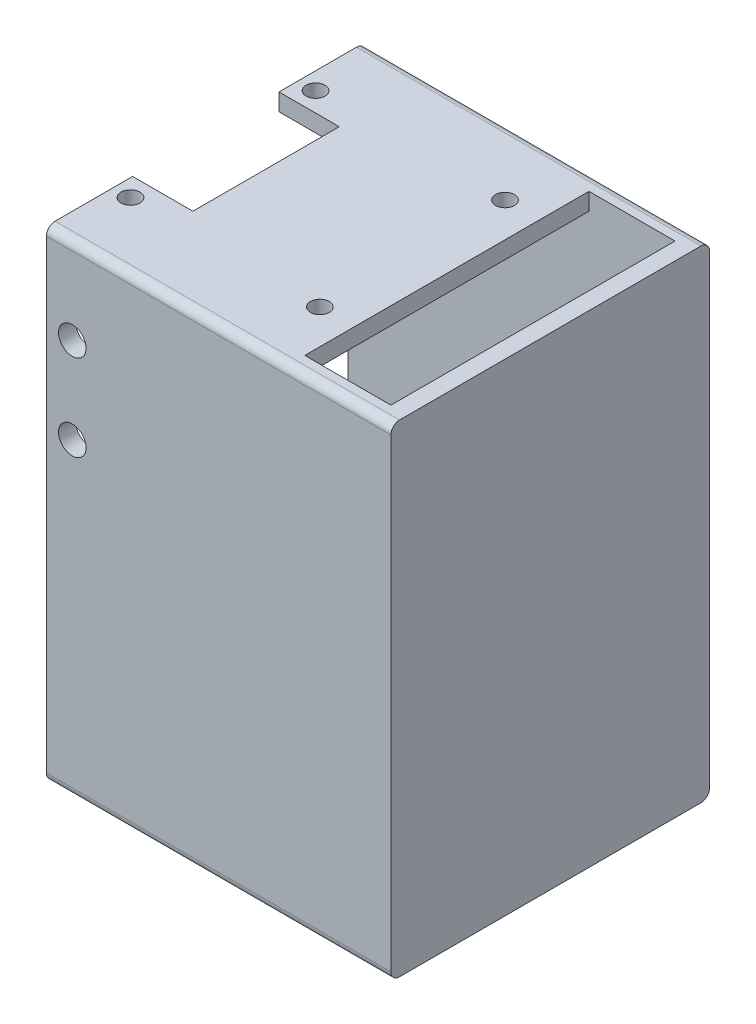
ISO-10303-21;
HEADER;
FILE_DESCRIPTION(('STEP AP214'),'2;1');
FILE_NAME('part.step','',(''),(''),'','','');
FILE_SCHEMA(('AUTOMOTIVE_DESIGN { 1 0 10303 214 1 1 1 1 }'));
ENDSEC;
DATA;
#1=APPLICATION_CONTEXT('core data for automotive mechanical design processes');
#2=APPLICATION_PROTOCOL_DEFINITION('international standard','automotive_design',2000,#1);
#3=PRODUCT_CONTEXT('',#1,'mechanical');
#4=PRODUCT('Part','Part','',(#3));
#5=PRODUCT_RELATED_PRODUCT_CATEGORY('part','',(#4));
#6=PRODUCT_DEFINITION_FORMATION('','',#4);
#7=PRODUCT_DEFINITION_CONTEXT('part definition',#1,'design');
#8=PRODUCT_DEFINITION('design','',#6,#7);
#9=PRODUCT_DEFINITION_SHAPE('','',#8);
#10=(LENGTH_UNIT() NAMED_UNIT(*) SI_UNIT(.MILLI.,.METRE.));
#11=(NAMED_UNIT(*) PLANE_ANGLE_UNIT() SI_UNIT($,.RADIAN.));
#12=(NAMED_UNIT(*) SI_UNIT($,.STERADIAN.) SOLID_ANGLE_UNIT());
#13=UNCERTAINTY_MEASURE_WITH_UNIT(LENGTH_MEASURE(1.E-05),#10,'distance_accuracy_value','');
#14=(GEOMETRIC_REPRESENTATION_CONTEXT(3) GLOBAL_UNCERTAINTY_ASSIGNED_CONTEXT((#13)) GLOBAL_UNIT_ASSIGNED_CONTEXT((#10,
#11,#12)) REPRESENTATION_CONTEXT('',''));
#15=CARTESIAN_POINT('',(0.,0.,0.));
#16=DIRECTION('',(0.,0.,1.));
#17=DIRECTION('',(1.,0.,0.));
#18=AXIS2_PLACEMENT_3D('',#15,#16,#17);
#19=CARTESIAN_POINT('',(20.,51.,18.5));
#20=DIRECTION('',(-1.,0.,0.));
#21=DIRECTION('',(0.,0.,1.));
#22=AXIS2_PLACEMENT_3D('',#19,#20,#21);
#23=PLANE('',#22);
#24=DIRECTION('',(0.,0.,-1.));
#25=VECTOR('',#24,1.);
#26=CARTESIAN_POINT('',(20.,51.,18.5));
#27=LINE('',#26,#25);
#28=CARTESIAN_POINT('',(20.,51.,17.5));
#29=VERTEX_POINT('',#28);
#30=CARTESIAN_POINT('',(20.,51.,-17.5));
#31=VERTEX_POINT('',#30);
#32=EDGE_CURVE('E206',#29,#31,#27,.T.);
#33=ORIENTED_EDGE('',*,*,#32,.F.);
#34=CARTESIAN_POINT('',(20.,50.,17.5));
#35=DIRECTION('',(-1.,0.,0.));
#36=DIRECTION('',(0.,0.,1.));
#37=AXIS2_PLACEMENT_3D('',#34,#35,#36);
#38=CIRCLE('',#37,1.);
#39=CARTESIAN_POINT('',(20.,50.,18.5));
#40=VERTEX_POINT('',#39);
#41=EDGE_CURVE('E250',#29,#40,#38,.F.);
#42=ORIENTED_EDGE('',*,*,#41,.T.);
#43=DIRECTION('',(0.,-1.,0.));
#44=VECTOR('',#43,1.);
#45=CARTESIAN_POINT('',(20.,51.,18.5));
#46=LINE('',#45,#44);
#47=CARTESIAN_POINT('',(20.,-4.,18.5));
#48=VERTEX_POINT('',#47);
#49=EDGE_CURVE('E218',#40,#48,#46,.T.);
#50=ORIENTED_EDGE('',*,*,#49,.T.);
#51=CARTESIAN_POINT('',(20.,-4.,17.5));
#52=DIRECTION('',(-1.,0.,0.));
#53=DIRECTION('',(0.,0.,1.));
#54=AXIS2_PLACEMENT_3D('',#51,#52,#53);
#55=CIRCLE('',#54,1.);
#56=CARTESIAN_POINT('',(20.,-5.,17.5));
#57=VERTEX_POINT('',#56);
#58=EDGE_CURVE('E244',#48,#57,#55,.F.);
#59=ORIENTED_EDGE('',*,*,#58,.T.);
#60=DIRECTION('',(0.,0.,-1.));
#61=VECTOR('',#60,1.);
#62=CARTESIAN_POINT('',(20.,-5.,-18.5));
#63=LINE('',#62,#61);
#64=CARTESIAN_POINT('',(20.,-5.,-17.5));
#65=VERTEX_POINT('',#64);
#66=EDGE_CURVE('E272',#57,#65,#63,.T.);
#67=ORIENTED_EDGE('',*,*,#66,.T.);
#68=CARTESIAN_POINT('',(20.,-4.,-17.5));
#69=DIRECTION('',(-1.,0.,0.));
#70=DIRECTION('',(0.,0.,1.));
#71=AXIS2_PLACEMENT_3D('',#68,#69,#70);
#72=CIRCLE('',#71,1.);
#73=CARTESIAN_POINT('',(20.,-4.,-18.5));
#74=VERTEX_POINT('',#73);
#75=EDGE_CURVE('E246',#65,#74,#72,.F.);
#76=ORIENTED_EDGE('',*,*,#75,.T.);
#77=DIRECTION('',(0.,-1.,0.));
#78=VECTOR('',#77,1.);
#79=CARTESIAN_POINT('',(20.,51.,-18.5));
#80=LINE('',#79,#78);
#81=CARTESIAN_POINT('',(20.,50.,-18.5));
#82=VERTEX_POINT('',#81);
#83=EDGE_CURVE('E226',#82,#74,#80,.T.);
#84=ORIENTED_EDGE('',*,*,#83,.F.);
#85=CARTESIAN_POINT('',(20.,50.,-17.5));
#86=DIRECTION('',(-1.,0.,0.));
#87=DIRECTION('',(0.,0.,1.));
#88=AXIS2_PLACEMENT_3D('',#85,#86,#87);
#89=CIRCLE('',#88,1.);
#90=EDGE_CURVE('E248',#82,#31,#89,.F.);
#91=ORIENTED_EDGE('',*,*,#90,.T.);
#92=EDGE_LOOP('',(#33,#42,#50,#59,#67,#76,#84,#91));
#93=FACE_BOUND('',#92,.T.);
#94=ADVANCED_FACE('F39',(#93),#23,.F.);
#95=CARTESIAN_POINT('',(-20.,51.,-18.5));
#96=DIRECTION('',(0.,0.,1.));
#97=DIRECTION('',(1.,0.,0.));
#98=AXIS2_PLACEMENT_3D('',#95,#96,#97);
#99=PLANE('',#98);
#100=CARTESIAN_POINT('',(-17.,41.,-18.5));
#101=DIRECTION('',(0.,0.,-1.));
#102=DIRECTION('',(-1.,0.,0.));
#103=AXIS2_PLACEMENT_3D('',#100,#101,#102);
#104=CIRCLE('',#103,1.6);
#105=CARTESIAN_POINT('',(-18.6,41.,-18.5));
#106=VERTEX_POINT('',#105);
#107=EDGE_CURVE('E502',#106,#106,#104,.T.);
#108=ORIENTED_EDGE('',*,*,#107,.F.);
#109=EDGE_LOOP('',(#108));
#110=FACE_BOUND('',#109,.T.);
#111=CARTESIAN_POINT('',(-17.,31.,-18.5));
#112=DIRECTION('',(0.,0.,-1.));
#113=DIRECTION('',(-1.,0.,0.));
#114=AXIS2_PLACEMENT_3D('',#111,#112,#113);
#115=CIRCLE('',#114,1.6);
#116=CARTESIAN_POINT('',(-18.6,31.,-18.5));
#117=VERTEX_POINT('',#116);
#118=EDGE_CURVE('E499',#117,#117,#115,.T.);
#119=ORIENTED_EDGE('',*,*,#118,.F.);
#120=EDGE_LOOP('',(#119));
#121=FACE_BOUND('',#120,.T.);
#122=DIRECTION('',(0.,-1.,0.));
#123=VECTOR('',#122,1.);
#124=CARTESIAN_POINT('',(-20.,51.,-18.5));
#125=LINE('',#124,#123);
#126=CARTESIAN_POINT('',(-20.,50.,-18.5));
#127=VERTEX_POINT('',#126);
#128=CARTESIAN_POINT('',(-20.,-4.,-18.5));
#129=VERTEX_POINT('',#128);
#130=EDGE_CURVE('E224',#127,#129,#125,.T.);
#131=ORIENTED_EDGE('',*,*,#130,.F.);
#132=DIRECTION('',(-1.,0.,0.));
#133=VECTOR('',#132,1.);
#134=CARTESIAN_POINT('',(-20.,50.,-18.5));
#135=LINE('',#134,#133);
#136=EDGE_CURVE('E265',#127,#82,#135,.F.);
#137=ORIENTED_EDGE('',*,*,#136,.T.);
#138=ORIENTED_EDGE('',*,*,#83,.T.);
#139=DIRECTION('',(-1.,0.,0.));
#140=VECTOR('',#139,1.);
#141=CARTESIAN_POINT('',(-20.,-4.,-18.5));
#142=LINE('',#141,#140);
#143=EDGE_CURVE('E262',#74,#129,#142,.T.);
#144=ORIENTED_EDGE('',*,*,#143,.T.);
#145=EDGE_LOOP('',(#131,#137,#138,#144));
#146=FACE_BOUND('',#145,.T.);
#147=ADVANCED_FACE('F385',(#110,#121,#146),#99,.F.);
#148=CARTESIAN_POINT('',(-20.,51.,18.5));
#149=DIRECTION('',(1.,0.,0.));
#150=DIRECTION('',(0.,0.,-1.));
#151=AXIS2_PLACEMENT_3D('',#148,#149,#150);
#152=PLANE('',#151);
#153=CARTESIAN_POINT('',(-20.,-2.,15.5));
#154=DIRECTION('',(-1.,0.,0.));
#155=DIRECTION('',(0.,0.,-1.));
#156=AXIS2_PLACEMENT_3D('',#153,#154,#155);
#157=CIRCLE('',#156,1.1);
#158=CARTESIAN_POINT('',(-20.,-2.,14.4));
#159=VERTEX_POINT('',#158);
#160=EDGE_CURVE('E462',#159,#159,#157,.T.);
#161=ORIENTED_EDGE('',*,*,#160,.F.);
#162=EDGE_LOOP('',(#161));
#163=FACE_BOUND('',#162,.T.);
#164=CARTESIAN_POINT('',(-20.,-2.,-15.5));
#165=DIRECTION('',(-1.,0.,0.));
#166=DIRECTION('',(0.,0.,1.));
#167=AXIS2_PLACEMENT_3D('',#164,#165,#166);
#168=CIRCLE('',#167,1.1);
#169=CARTESIAN_POINT('',(-20.,-2.,-14.4));
#170=VERTEX_POINT('',#169);
#171=EDGE_CURVE('E466',#170,#170,#168,.T.);
#172=ORIENTED_EDGE('',*,*,#171,.F.);
#173=EDGE_LOOP('',(#172));
#174=FACE_BOUND('',#173,.T.);
#175=CARTESIAN_POINT('',(-20.,-2.,10.));
#176=DIRECTION('',(-1.,0.,0.));
#177=DIRECTION('',(0.,0.,-1.));
#178=AXIS2_PLACEMENT_3D('',#175,#176,#177);
#179=CIRCLE('',#178,1.6);
#180=CARTESIAN_POINT('',(-20.,-2.,8.4));
#181=VERTEX_POINT('',#180);
#182=EDGE_CURVE('E470',#181,#181,#179,.T.);
#183=ORIENTED_EDGE('',*,*,#182,.F.);
#184=EDGE_LOOP('',(#183));
#185=FACE_BOUND('',#184,.T.);
#186=CARTESIAN_POINT('',(-20.,-2.,-10.));
#187=DIRECTION('',(-1.,0.,0.));
#188=DIRECTION('',(0.,0.,1.));
#189=AXIS2_PLACEMENT_3D('',#186,#187,#188);
#190=CIRCLE('',#189,1.6);
#191=CARTESIAN_POINT('',(-20.,-2.,-8.4));
#192=VERTEX_POINT('',#191);
#193=EDGE_CURVE('E279',#192,#192,#190,.T.);
#194=ORIENTED_EDGE('',*,*,#193,.F.);
#195=EDGE_LOOP('',(#194));
#196=FACE_BOUND('',#195,.T.);
#197=DIRECTION('',(0.,-1.,0.));
#198=VECTOR('',#197,1.);
#199=CARTESIAN_POINT('',(-20.,51.,18.5));
#200=LINE('',#199,#198);
#201=CARTESIAN_POINT('',(-20.,50.,18.5));
#202=VERTEX_POINT('',#201);
#203=CARTESIAN_POINT('',(-20.,-4.,18.5));
#204=VERTEX_POINT('',#203);
#205=EDGE_CURVE('E221',#202,#204,#200,.T.);
#206=ORIENTED_EDGE('',*,*,#205,.F.);
#207=CARTESIAN_POINT('',(-20.,50.,17.5));
#208=DIRECTION('',(1.,0.,0.));
#209=DIRECTION('',(0.,0.,-1.));
#210=AXIS2_PLACEMENT_3D('',#207,#208,#209);
#211=CIRCLE('',#210,1.);
#212=CARTESIAN_POINT('',(-20.,51.,17.5));
#213=VERTEX_POINT('',#212);
#214=EDGE_CURVE('E260',#202,#213,#211,.F.);
#215=ORIENTED_EDGE('',*,*,#214,.T.);
#216=DIRECTION('',(0.,0.,1.));
#217=VECTOR('',#216,1.);
#218=CARTESIAN_POINT('',(-20.,51.,18.5));
#219=LINE('',#218,#217);
#220=CARTESIAN_POINT('',(-20.,51.,8.49999999999999));
#221=VERTEX_POINT('',#220);
#222=EDGE_CURVE('E185',#221,#213,#219,.T.);
#223=ORIENTED_EDGE('',*,*,#222,.F.);
#224=DIRECTION('',(0.,1.,0.));
#225=VECTOR('',#224,1.);
#226=CARTESIAN_POINT('',(-20.,-0.001000000000001,8.49999999999999));
#227=LINE('',#226,#225);
#228=CARTESIAN_POINT('',(-20.,49.,8.49999999999999));
#229=VERTEX_POINT('',#228);
#230=EDGE_CURVE('E169',#229,#221,#227,.T.);
#231=ORIENTED_EDGE('',*,*,#230,.F.);
#232=DIRECTION('',(0.,0.,-1.));
#233=VECTOR('',#232,1.);
#234=CARTESIAN_POINT('',(-20.,49.,16.5));
#235=LINE('',#234,#233);
#236=CARTESIAN_POINT('',(-20.,49.,16.5));
#237=VERTEX_POINT('',#236);
#238=EDGE_CURVE('E183',#237,#229,#235,.T.);
#239=ORIENTED_EDGE('',*,*,#238,.F.);
#240=DIRECTION('',(0.,1.,0.));
#241=VECTOR('',#240,1.);
#242=CARTESIAN_POINT('',(-20.,2.,16.5));
#243=LINE('',#242,#241);
#244=CARTESIAN_POINT('',(-20.,2.,16.5));
#245=VERTEX_POINT('',#244);
#246=EDGE_CURVE('E199',#245,#237,#243,.T.);
#247=ORIENTED_EDGE('',*,*,#246,.F.);
#248=DIRECTION('',(0.,0.,1.));
#249=VECTOR('',#248,1.);
#250=CARTESIAN_POINT('',(-20.,2.,-16.5));
#251=LINE('',#250,#249);
#252=CARTESIAN_POINT('',(-20.,2.,-16.5));
#253=VERTEX_POINT('',#252);
#254=EDGE_CURVE('E345',#253,#245,#251,.T.);
#255=ORIENTED_EDGE('',*,*,#254,.F.);
#256=DIRECTION('',(0.,-1.,0.));
#257=VECTOR('',#256,1.);
#258=CARTESIAN_POINT('',(-20.,49.,-16.5));
#259=LINE('',#258,#257);
#260=CARTESIAN_POINT('',(-20.,49.,-16.5));
#261=VERTEX_POINT('',#260);
#262=EDGE_CURVE('E340',#261,#253,#259,.T.);
#263=ORIENTED_EDGE('',*,*,#262,.F.);
#264=CARTESIAN_POINT('',(-20.,49.,-8.5));
#265=VERTEX_POINT('',#264);
#266=EDGE_CURVE('E194',#265,#261,#235,.T.);
#267=ORIENTED_EDGE('',*,*,#266,.F.);
#268=DIRECTION('',(0.,1.,0.));
#269=VECTOR('',#268,1.);
#270=CARTESIAN_POINT('',(-20.,-0.001000000000001,-8.5));
#271=LINE('',#270,#269);
#272=CARTESIAN_POINT('',(-20.,51.,-8.5));
#273=VERTEX_POINT('',#272);
#274=EDGE_CURVE('E176',#265,#273,#271,.T.);
#275=ORIENTED_EDGE('',*,*,#274,.T.);
#276=CARTESIAN_POINT('',(-20.,51.,-17.5));
#277=VERTEX_POINT('',#276);
#278=EDGE_CURVE('E216',#277,#273,#219,.T.);
#279=ORIENTED_EDGE('',*,*,#278,.F.);
#280=CARTESIAN_POINT('',(-20.,50.,-17.5));
#281=DIRECTION('',(1.,0.,0.));
#282=DIRECTION('',(0.,0.,-1.));
#283=AXIS2_PLACEMENT_3D('',#280,#281,#282);
#284=CIRCLE('',#283,1.);
#285=EDGE_CURVE('E258',#277,#127,#284,.F.);
#286=ORIENTED_EDGE('',*,*,#285,.T.);
#287=ORIENTED_EDGE('',*,*,#130,.T.);
#288=CARTESIAN_POINT('',(-20.,-4.,-17.5));
#289=DIRECTION('',(1.,0.,0.));
#290=DIRECTION('',(0.,0.,-1.));
#291=AXIS2_PLACEMENT_3D('',#288,#289,#290);
#292=CIRCLE('',#291,1.);
#293=CARTESIAN_POINT('',(-20.,-5.,-17.5));
#294=VERTEX_POINT('',#293);
#295=EDGE_CURVE('E62',#129,#294,#292,.F.);
#296=ORIENTED_EDGE('',*,*,#295,.T.);
#297=DIRECTION('',(0.,0.,1.));
#298=VECTOR('',#297,1.);
#299=CARTESIAN_POINT('',(-20.,-5.,-18.5));
#300=LINE('',#299,#298);
#301=CARTESIAN_POINT('',(-20.,-5.,17.5));
#302=VERTEX_POINT('',#301);
#303=EDGE_CURVE('E269',#294,#302,#300,.T.);
#304=ORIENTED_EDGE('',*,*,#303,.T.);
#305=CARTESIAN_POINT('',(-20.,-4.,17.5));
#306=DIRECTION('',(1.,0.,0.));
#307=DIRECTION('',(0.,0.,-1.));
#308=AXIS2_PLACEMENT_3D('',#305,#306,#307);
#309=CIRCLE('',#308,1.);
#310=EDGE_CURVE('E54',#302,#204,#309,.F.);
#311=ORIENTED_EDGE('',*,*,#310,.T.);
#312=EDGE_LOOP('',(#206,#215,#223,#231,#239,#247,#255,#263,#267,#275,#279,#286,#287,#296,#304,#311));
#313=FACE_BOUND('',#312,.T.);
#314=ADVANCED_FACE('F181',(#163,#174,#185,#196,#313),#152,.F.);
#315=CARTESIAN_POINT('',(-20.,51.,18.5));
#316=DIRECTION('',(0.,0.,-1.));
#317=DIRECTION('',(-1.,0.,0.));
#318=AXIS2_PLACEMENT_3D('',#315,#316,#317);
#319=PLANE('',#318);
#320=CARTESIAN_POINT('',(-17.,41.,18.5));
#321=DIRECTION('',(0.,0.,-1.));
#322=DIRECTION('',(-1.,0.,0.));
#323=AXIS2_PLACEMENT_3D('',#320,#321,#322);
#324=CIRCLE('',#323,1.6);
#325=CARTESIAN_POINT('',(-18.6,41.,18.5));
#326=VERTEX_POINT('',#325);
#327=EDGE_CURVE('E234',#326,#326,#324,.F.);
#328=ORIENTED_EDGE('',*,*,#327,.F.);
#329=EDGE_LOOP('',(#328));
#330=FACE_BOUND('',#329,.T.);
#331=CARTESIAN_POINT('',(-17.,31.,18.5));
#332=DIRECTION('',(0.,0.,-1.));
#333=DIRECTION('',(-1.,0.,0.));
#334=AXIS2_PLACEMENT_3D('',#331,#332,#333);
#335=CIRCLE('',#334,1.6);
#336=CARTESIAN_POINT('',(-18.6,31.,18.5));
#337=VERTEX_POINT('',#336);
#338=EDGE_CURVE('E503',#337,#337,#335,.F.);
#339=ORIENTED_EDGE('',*,*,#338,.F.);
#340=EDGE_LOOP('',(#339));
#341=FACE_BOUND('',#340,.T.);
#342=ORIENTED_EDGE('',*,*,#49,.F.);
#343=DIRECTION('',(1.,0.,0.));
#344=VECTOR('',#343,1.);
#345=CARTESIAN_POINT('',(-20.,50.,18.5));
#346=LINE('',#345,#344);
#347=EDGE_CURVE('E254',#40,#202,#346,.F.);
#348=ORIENTED_EDGE('',*,*,#347,.T.);
#349=ORIENTED_EDGE('',*,*,#205,.T.);
#350=DIRECTION('',(-1.,0.,0.));
#351=VECTOR('',#350,1.);
#352=CARTESIAN_POINT('',(20.,-4.,18.5));
#353=LINE('',#352,#351);
#354=EDGE_CURVE('E252',#204,#48,#353,.F.);
#355=ORIENTED_EDGE('',*,*,#354,.T.);
#356=EDGE_LOOP('',(#342,#348,#349,#355));
#357=FACE_BOUND('',#356,.T.);
#358=ADVANCED_FACE('F451',(#330,#341,#357),#319,.F.);
#359=CARTESIAN_POINT('',(0.,51.,0.));
#360=DIRECTION('',(0.,-1.,0.));
#361=DIRECTION('',(0.,0.,-1.));
#362=AXIS2_PLACEMENT_3D('',#359,#360,#361);
#363=PLANE('',#362);
#364=CARTESIAN_POINT('',(-18.,51.,10.75));
#365=DIRECTION('',(0.,1.,0.));
#366=DIRECTION('',(0.,0.,1.));
#367=AXIS2_PLACEMENT_3D('',#364,#365,#366);
#368=CIRCLE('',#367,1.1);
#369=CARTESIAN_POINT('',(-18.,51.,11.85));
#370=VERTEX_POINT('',#369);
#371=EDGE_CURVE('E292',#370,#370,#368,.T.);
#372=ORIENTED_EDGE('',*,*,#371,.F.);
#373=EDGE_LOOP('',(#372));
#374=FACE_BOUND('',#373,.T.);
#375=CARTESIAN_POINT('',(4.,51.,-10.75));
#376=DIRECTION('',(0.,1.,0.));
#377=DIRECTION('',(0.,0.,1.));
#378=AXIS2_PLACEMENT_3D('',#375,#376,#377);
#379=CIRCLE('',#378,1.1);
#380=CARTESIAN_POINT('',(4.,51.,-9.65));
#381=VERTEX_POINT('',#380);
#382=EDGE_CURVE('E293',#381,#381,#379,.T.);
#383=ORIENTED_EDGE('',*,*,#382,.F.);
#384=EDGE_LOOP('',(#383));
#385=FACE_BOUND('',#384,.T.);
#386=CARTESIAN_POINT('',(4.,51.,10.75));
#387=DIRECTION('',(0.,1.,0.));
#388=DIRECTION('',(0.,0.,-1.));
#389=AXIS2_PLACEMENT_3D('',#386,#387,#388);
#390=CIRCLE('',#389,1.1);
#391=CARTESIAN_POINT('',(4.,51.,9.65));
#392=VERTEX_POINT('',#391);
#393=EDGE_CURVE('E285',#392,#392,#390,.T.);
#394=ORIENTED_EDGE('',*,*,#393,.F.);
#395=EDGE_LOOP('',(#394));
#396=FACE_BOUND('',#395,.T.);
#397=CARTESIAN_POINT('',(-18.,51.,-10.75));
#398=DIRECTION('',(0.,1.,0.));
#399=DIRECTION('',(0.,0.,1.));
#400=AXIS2_PLACEMENT_3D('',#397,#398,#399);
#401=CIRCLE('',#400,1.1);
#402=CARTESIAN_POINT('',(-18.,51.,-9.65));
#403=VERTEX_POINT('',#402);
#404=EDGE_CURVE('E296',#403,#403,#401,.T.);
#405=ORIENTED_EDGE('',*,*,#404,.F.);
#406=EDGE_LOOP('',(#405));
#407=FACE_BOUND('',#406,.T.);
#408=DIRECTION('',(-1.,0.,0.));
#409=VECTOR('',#408,1.);
#410=CARTESIAN_POINT('',(8.,51.,-16.5));
#411=LINE('',#410,#409);
#412=CARTESIAN_POINT('',(18.,51.,-16.5));
#413=VERTEX_POINT('',#412);
#414=CARTESIAN_POINT('',(8.,51.,-16.5));
#415=VERTEX_POINT('',#414);
#416=EDGE_CURVE('E328',#413,#415,#411,.T.);
#417=ORIENTED_EDGE('',*,*,#416,.F.);
#418=DIRECTION('',(0.,0.,-1.));
#419=VECTOR('',#418,1.);
#420=CARTESIAN_POINT('',(18.,51.,-16.5));
#421=LINE('',#420,#419);
#422=CARTESIAN_POINT('',(18.,51.,16.5));
#423=VERTEX_POINT('',#422);
#424=EDGE_CURVE('E325',#423,#413,#421,.T.);
#425=ORIENTED_EDGE('',*,*,#424,.F.);
#426=DIRECTION('',(1.,0.,0.));
#427=VECTOR('',#426,1.);
#428=CARTESIAN_POINT('',(8.00000000000001,51.,16.5));
#429=LINE('',#428,#427);
#430=CARTESIAN_POINT('',(8.00000000000001,51.,16.5));
#431=VERTEX_POINT('',#430);
#432=EDGE_CURVE('E334',#431,#423,#429,.T.);
#433=ORIENTED_EDGE('',*,*,#432,.F.);
#434=DIRECTION('',(0.,0.,1.));
#435=VECTOR('',#434,1.);
#436=CARTESIAN_POINT('',(8.,51.,-16.5));
#437=LINE('',#436,#435);
#438=EDGE_CURVE('E331',#415,#431,#437,.T.);
#439=ORIENTED_EDGE('',*,*,#438,.F.);
#440=EDGE_LOOP('',(#417,#425,#433,#439));
#441=FACE_BOUND('',#440,.T.);
#442=ORIENTED_EDGE('',*,*,#222,.T.);
#443=DIRECTION('',(1.,0.,0.));
#444=VECTOR('',#443,1.);
#445=CARTESIAN_POINT('',(0.,51.,17.5));
#446=LINE('',#445,#444);
#447=EDGE_CURVE('E241',#213,#29,#446,.T.);
#448=ORIENTED_EDGE('',*,*,#447,.T.);
#449=ORIENTED_EDGE('',*,*,#32,.T.);
#450=DIRECTION('',(-1.,0.,0.));
#451=VECTOR('',#450,1.);
#452=CARTESIAN_POINT('',(0.,51.,-17.5));
#453=LINE('',#452,#451);
#454=EDGE_CURVE('E229',#31,#277,#453,.T.);
#455=ORIENTED_EDGE('',*,*,#454,.T.);
#456=ORIENTED_EDGE('',*,*,#278,.T.);
#457=DIRECTION('',(-1.,0.,0.));
#458=VECTOR('',#457,1.);
#459=CARTESIAN_POINT('',(-13.,51.,-8.5));
#460=LINE('',#459,#458);
#461=CARTESIAN_POINT('',(-13.,51.,-8.5));
#462=VERTEX_POINT('',#461);
#463=EDGE_CURVE('E186',#462,#273,#460,.T.);
#464=ORIENTED_EDGE('',*,*,#463,.F.);
#465=DIRECTION('',(0.,0.,-1.));
#466=VECTOR('',#465,1.);
#467=CARTESIAN_POINT('',(-13.,51.,8.49999999999999));
#468=LINE('',#467,#466);
#469=CARTESIAN_POINT('',(-13.,51.,8.49999999999999));
#470=VERTEX_POINT('',#469);
#471=EDGE_CURVE('E313',#470,#462,#468,.T.);
#472=ORIENTED_EDGE('',*,*,#471,.F.);
#473=DIRECTION('',(1.,0.,0.));
#474=VECTOR('',#473,1.);
#475=CARTESIAN_POINT('',(-13.,51.,8.49999999999999));
#476=LINE('',#475,#474);
#477=EDGE_CURVE('E311',#221,#470,#476,.T.);
#478=ORIENTED_EDGE('',*,*,#477,.F.);
#479=EDGE_LOOP('',(#442,#448,#449,#455,#456,#464,#472,#478));
#480=FACE_BOUND('',#479,.T.);
#481=ADVANCED_FACE('F366',(#374,#385,#396,#407,#441,#480),#363,.F.);
#482=CARTESIAN_POINT('',(18.,49.,-16.5));
#483=DIRECTION('',(0.,0.,-1.));
#484=DIRECTION('',(-1.,0.,0.));
#485=AXIS2_PLACEMENT_3D('',#482,#483,#484);
#486=PLANE('',#485);
#487=CARTESIAN_POINT('',(-17.,41.,-16.5));
#488=DIRECTION('',(0.,0.,-1.));
#489=DIRECTION('',(-1.,0.,0.));
#490=AXIS2_PLACEMENT_3D('',#487,#488,#489);
#491=CIRCLE('',#490,1.6);
#492=CARTESIAN_POINT('',(-18.6,41.,-16.5));
#493=VERTEX_POINT('',#492);
#494=EDGE_CURVE('E238',#493,#493,#491,.T.);
#495=ORIENTED_EDGE('',*,*,#494,.T.);
#496=EDGE_LOOP('',(#495));
#497=FACE_BOUND('',#496,.T.);
#498=CARTESIAN_POINT('',(-17.,31.,-16.5));
#499=DIRECTION('',(0.,0.,-1.));
#500=DIRECTION('',(-1.,0.,0.));
#501=AXIS2_PLACEMENT_3D('',#498,#499,#500);
#502=CIRCLE('',#501,1.6);
#503=CARTESIAN_POINT('',(-18.6,31.,-16.5));
#504=VERTEX_POINT('',#503);
#505=EDGE_CURVE('E233',#504,#504,#502,.T.);
#506=ORIENTED_EDGE('',*,*,#505,.T.);
#507=EDGE_LOOP('',(#506));
#508=FACE_BOUND('',#507,.T.);
#509=ORIENTED_EDGE('',*,*,#262,.T.);
#510=DIRECTION('',(-1.,0.,0.));
#511=VECTOR('',#510,1.);
#512=CARTESIAN_POINT('',(18.,2.,-16.5));
#513=LINE('',#512,#511);
#514=CARTESIAN_POINT('',(18.,2.,-16.5));
#515=VERTEX_POINT('',#514);
#516=EDGE_CURVE('E210',#515,#253,#513,.T.);
#517=ORIENTED_EDGE('',*,*,#516,.F.);
#518=DIRECTION('',(0.,-1.,0.));
#519=VECTOR('',#518,1.);
#520=CARTESIAN_POINT('',(18.,49.,-16.5));
#521=LINE('',#520,#519);
#522=EDGE_CURVE('E193',#413,#515,#521,.T.);
#523=ORIENTED_EDGE('',*,*,#522,.F.);
#524=ORIENTED_EDGE('',*,*,#416,.T.);
#525=DIRECTION('',(0.,1.,0.));
#526=VECTOR('',#525,1.);
#527=CARTESIAN_POINT('',(8.,-0.001000000000001,-16.5));
#528=LINE('',#527,#526);
#529=CARTESIAN_POINT('',(8.,49.,-16.5));
#530=VERTEX_POINT('',#529);
#531=EDGE_CURVE('E337',#530,#415,#528,.T.);
#532=ORIENTED_EDGE('',*,*,#531,.F.);
#533=DIRECTION('',(-1.,0.,0.));
#534=VECTOR('',#533,1.);
#535=CARTESIAN_POINT('',(18.,49.,-16.5));
#536=LINE('',#535,#534);
#537=EDGE_CURVE('E203',#530,#261,#536,.T.);
#538=ORIENTED_EDGE('',*,*,#537,.T.);
#539=EDGE_LOOP('',(#509,#517,#523,#524,#532,#538));
#540=FACE_BOUND('',#539,.T.);
#541=ADVANCED_FACE('F355',(#497,#508,#540),#486,.F.);
#542=CARTESIAN_POINT('',(18.,49.,16.5));
#543=DIRECTION('',(0.,1.,0.));
#544=DIRECTION('',(0.,0.,1.));
#545=AXIS2_PLACEMENT_3D('',#542,#543,#544);
#546=PLANE('',#545);
#547=CARTESIAN_POINT('',(-18.,49.,10.75));
#548=DIRECTION('',(0.,1.,0.));
#549=DIRECTION('',(0.,0.,1.));
#550=AXIS2_PLACEMENT_3D('',#547,#548,#549);
#551=CIRCLE('',#550,1.1);
#552=CARTESIAN_POINT('',(-18.,49.,11.85));
#553=VERTEX_POINT('',#552);
#554=EDGE_CURVE('E289',#553,#553,#551,.F.);
#555=ORIENTED_EDGE('',*,*,#554,.F.);
#556=EDGE_LOOP('',(#555));
#557=FACE_BOUND('',#556,.T.);
#558=CARTESIAN_POINT('',(4.,49.,-10.75));
#559=DIRECTION('',(0.,1.,0.));
#560=DIRECTION('',(0.,0.,1.));
#561=AXIS2_PLACEMENT_3D('',#558,#559,#560);
#562=CIRCLE('',#561,1.1);
#563=CARTESIAN_POINT('',(4.,49.,-9.65));
#564=VERTEX_POINT('',#563);
#565=EDGE_CURVE('E288',#564,#564,#562,.F.);
#566=ORIENTED_EDGE('',*,*,#565,.F.);
#567=EDGE_LOOP('',(#566));
#568=FACE_BOUND('',#567,.T.);
#569=CARTESIAN_POINT('',(4.,49.,10.75));
#570=DIRECTION('',(0.,1.,0.));
#571=DIRECTION('',(0.,0.,1.));
#572=AXIS2_PLACEMENT_3D('',#569,#570,#571);
#573=CIRCLE('',#572,1.1);
#574=CARTESIAN_POINT('',(4.,49.,11.85));
#575=VERTEX_POINT('',#574);
#576=EDGE_CURVE('E276',#575,#575,#573,.F.);
#577=ORIENTED_EDGE('',*,*,#576,.F.);
#578=EDGE_LOOP('',(#577));
#579=FACE_BOUND('',#578,.T.);
#580=CARTESIAN_POINT('',(-18.,49.,-10.75));
#581=DIRECTION('',(0.,1.,0.));
#582=DIRECTION('',(0.,0.,1.));
#583=AXIS2_PLACEMENT_3D('',#580,#581,#582);
#584=CIRCLE('',#583,1.1);
#585=CARTESIAN_POINT('',(-18.,49.,-9.65));
#586=VERTEX_POINT('',#585);
#587=EDGE_CURVE('E303',#586,#586,#584,.F.);
#588=ORIENTED_EDGE('',*,*,#587,.F.);
#589=EDGE_LOOP('',(#588));
#590=FACE_BOUND('',#589,.T.);
#591=DIRECTION('',(0.,0.,1.));
#592=VECTOR('',#591,1.);
#593=CARTESIAN_POINT('',(-13.,49.,8.49999999999999));
#594=LINE('',#593,#592);
#595=CARTESIAN_POINT('',(-13.,49.,-8.5));
#596=VERTEX_POINT('',#595);
#597=CARTESIAN_POINT('',(-13.,49.,8.49999999999999));
#598=VERTEX_POINT('',#597);
#599=EDGE_CURVE('E306',#596,#598,#594,.T.);
#600=ORIENTED_EDGE('',*,*,#599,.F.);
#601=DIRECTION('',(1.,0.,0.));
#602=VECTOR('',#601,1.);
#603=CARTESIAN_POINT('',(-13.,49.,-8.5));
#604=LINE('',#603,#602);
#605=EDGE_CURVE('E308',#265,#596,#604,.T.);
#606=ORIENTED_EDGE('',*,*,#605,.F.);
#607=ORIENTED_EDGE('',*,*,#266,.T.);
#608=ORIENTED_EDGE('',*,*,#537,.F.);
#609=DIRECTION('',(0.,0.,-1.));
#610=VECTOR('',#609,1.);
#611=CARTESIAN_POINT('',(8.,49.,-16.5));
#612=LINE('',#611,#610);
#613=CARTESIAN_POINT('',(8.00000000000001,49.,16.5));
#614=VERTEX_POINT('',#613);
#615=EDGE_CURVE('E175',#614,#530,#612,.T.);
#616=ORIENTED_EDGE('',*,*,#615,.F.);
#617=DIRECTION('',(-1.,0.,0.));
#618=VECTOR('',#617,1.);
#619=CARTESIAN_POINT('',(18.,49.,16.5));
#620=LINE('',#619,#618);
#621=EDGE_CURVE('E191',#614,#237,#620,.T.);
#622=ORIENTED_EDGE('',*,*,#621,.T.);
#623=ORIENTED_EDGE('',*,*,#238,.T.);
#624=DIRECTION('',(-1.,0.,0.));
#625=VECTOR('',#624,1.);
#626=CARTESIAN_POINT('',(-13.,49.,8.49999999999999));
#627=LINE('',#626,#625);
#628=EDGE_CURVE('E165',#598,#229,#627,.T.);
#629=ORIENTED_EDGE('',*,*,#628,.F.);
#630=EDGE_LOOP('',(#600,#606,#607,#608,#616,#622,#623,#629));
#631=FACE_BOUND('',#630,.T.);
#632=ADVANCED_FACE('F188',(#557,#568,#579,#590,#631),#546,.F.);
#633=CARTESIAN_POINT('',(18.,2.,16.5));
#634=DIRECTION('',(0.,0.,1.));
#635=DIRECTION('',(1.,0.,0.));
#636=AXIS2_PLACEMENT_3D('',#633,#634,#635);
#637=PLANE('',#636);
#638=CARTESIAN_POINT('',(-17.,41.,16.5));
#639=DIRECTION('',(0.,0.,1.));
#640=DIRECTION('',(1.,0.,0.));
#641=AXIS2_PLACEMENT_3D('',#638,#639,#640);
#642=CIRCLE('',#641,1.6);
#643=CARTESIAN_POINT('',(-15.4,41.,16.5));
#644=VERTEX_POINT('',#643);
#645=EDGE_CURVE('E235',#644,#644,#642,.T.);
#646=ORIENTED_EDGE('',*,*,#645,.T.);
#647=EDGE_LOOP('',(#646));
#648=FACE_BOUND('',#647,.T.);
#649=CARTESIAN_POINT('',(-17.,31.,16.5));
#650=DIRECTION('',(0.,0.,1.));
#651=DIRECTION('',(1.,0.,0.));
#652=AXIS2_PLACEMENT_3D('',#649,#650,#651);
#653=CIRCLE('',#652,1.6);
#654=CARTESIAN_POINT('',(-15.4,31.,16.5));
#655=VERTEX_POINT('',#654);
#656=EDGE_CURVE('E230',#655,#655,#653,.T.);
#657=ORIENTED_EDGE('',*,*,#656,.T.);
#658=EDGE_LOOP('',(#657));
#659=FACE_BOUND('',#658,.T.);
#660=ORIENTED_EDGE('',*,*,#246,.T.);
#661=ORIENTED_EDGE('',*,*,#621,.F.);
#662=DIRECTION('',(0.,1.,0.));
#663=VECTOR('',#662,1.);
#664=CARTESIAN_POINT('',(8.00000000000001,-0.001000000000001,16.5));
#665=LINE('',#664,#663);
#666=EDGE_CURVE('E338',#614,#431,#665,.T.);
#667=ORIENTED_EDGE('',*,*,#666,.T.);
#668=ORIENTED_EDGE('',*,*,#432,.T.);
#669=DIRECTION('',(0.,1.,0.));
#670=VECTOR('',#669,1.);
#671=CARTESIAN_POINT('',(18.,2.,16.5));
#672=LINE('',#671,#670);
#673=CARTESIAN_POINT('',(18.,2.,16.5));
#674=VERTEX_POINT('',#673);
#675=EDGE_CURVE('E213',#674,#423,#672,.T.);
#676=ORIENTED_EDGE('',*,*,#675,.F.);
#677=DIRECTION('',(-1.,0.,0.));
#678=VECTOR('',#677,1.);
#679=CARTESIAN_POINT('',(18.,2.,16.5));
#680=LINE('',#679,#678);
#681=EDGE_CURVE('E208',#674,#245,#680,.T.);
#682=ORIENTED_EDGE('',*,*,#681,.T.);
#683=EDGE_LOOP('',(#660,#661,#667,#668,#676,#682));
#684=FACE_BOUND('',#683,.T.);
#685=ADVANCED_FACE('F350',(#648,#659,#684),#637,.F.);
#686=CARTESIAN_POINT('',(18.,2.,-16.5));
#687=DIRECTION('',(0.,-1.,0.));
#688=DIRECTION('',(0.,0.,-1.));
#689=AXIS2_PLACEMENT_3D('',#686,#687,#688);
#690=PLANE('',#689);
#691=ORIENTED_EDGE('',*,*,#254,.T.);
#692=ORIENTED_EDGE('',*,*,#681,.F.);
#693=DIRECTION('',(0.,0.,1.));
#694=VECTOR('',#693,1.);
#695=CARTESIAN_POINT('',(18.,2.,-16.5));
#696=LINE('',#695,#694);
#697=EDGE_CURVE('E197',#515,#674,#696,.T.);
#698=ORIENTED_EDGE('',*,*,#697,.F.);
#699=ORIENTED_EDGE('',*,*,#516,.T.);
#700=EDGE_LOOP('',(#691,#692,#698,#699));
#701=FACE_BOUND('',#700,.T.);
#702=ADVANCED_FACE('F358',(#701),#690,.F.);
#703=CARTESIAN_POINT('',(18.,0.,0.));
#704=DIRECTION('',(-1.,0.,0.));
#705=DIRECTION('',(0.,0.,1.));
#706=AXIS2_PLACEMENT_3D('',#703,#704,#705);
#707=PLANE('',#706);
#708=ORIENTED_EDGE('',*,*,#522,.T.);
#709=ORIENTED_EDGE('',*,*,#697,.T.);
#710=ORIENTED_EDGE('',*,*,#675,.T.);
#711=ORIENTED_EDGE('',*,*,#424,.T.);
#712=EDGE_LOOP('',(#708,#709,#710,#711));
#713=FACE_BOUND('',#712,.T.);
#714=ADVANCED_FACE('F360',(#713),#707,.T.);
#715=CARTESIAN_POINT('',(8.,-0.001000000000001,-16.5));
#716=DIRECTION('',(-1.,0.,0.));
#717=DIRECTION('',(0.,0.,1.));
#718=AXIS2_PLACEMENT_3D('',#715,#716,#717);
#719=PLANE('',#718);
#720=ORIENTED_EDGE('',*,*,#615,.T.);
#721=ORIENTED_EDGE('',*,*,#531,.T.);
#722=ORIENTED_EDGE('',*,*,#438,.T.);
#723=ORIENTED_EDGE('',*,*,#666,.F.);
#724=EDGE_LOOP('',(#720,#721,#722,#723));
#725=FACE_BOUND('',#724,.T.);
#726=ADVANCED_FACE('F369',(#725),#719,.F.);
#727=CARTESIAN_POINT('',(-13.,-0.001000000000001,-8.5));
#728=DIRECTION('',(0.,0.,-1.));
#729=DIRECTION('',(-1.,0.,0.));
#730=AXIS2_PLACEMENT_3D('',#727,#728,#729);
#731=PLANE('',#730);
#732=ORIENTED_EDGE('',*,*,#605,.T.);
#733=DIRECTION('',(0.,1.,0.));
#734=VECTOR('',#733,1.);
#735=CARTESIAN_POINT('',(-13.,-0.001000000000001,-8.5));
#736=LINE('',#735,#734);
#737=EDGE_CURVE('E320',#596,#462,#736,.T.);
#738=ORIENTED_EDGE('',*,*,#737,.T.);
#739=ORIENTED_EDGE('',*,*,#463,.T.);
#740=ORIENTED_EDGE('',*,*,#274,.F.);
#741=EDGE_LOOP('',(#732,#738,#739,#740));
#742=FACE_BOUND('',#741,.T.);
#743=ADVANCED_FACE('F372',(#742),#731,.F.);
#744=CARTESIAN_POINT('',(-13.,-0.001000000000001,8.49999999999999));
#745=DIRECTION('',(1.,0.,0.));
#746=DIRECTION('',(0.,0.,-1.));
#747=AXIS2_PLACEMENT_3D('',#744,#745,#746);
#748=PLANE('',#747);
#749=ORIENTED_EDGE('',*,*,#599,.T.);
#750=DIRECTION('',(0.,1.,0.));
#751=VECTOR('',#750,1.);
#752=CARTESIAN_POINT('',(-13.,-0.001000000000001,8.49999999999999));
#753=LINE('',#752,#751);
#754=EDGE_CURVE('E171',#598,#470,#753,.T.);
#755=ORIENTED_EDGE('',*,*,#754,.T.);
#756=ORIENTED_EDGE('',*,*,#471,.T.);
#757=ORIENTED_EDGE('',*,*,#737,.F.);
#758=EDGE_LOOP('',(#749,#755,#756,#757));
#759=FACE_BOUND('',#758,.T.);
#760=ADVANCED_FACE('F422',(#759),#748,.F.);
#761=CARTESIAN_POINT('',(-13.,-0.001000000000001,8.49999999999999));
#762=DIRECTION('',(0.,0.,1.));
#763=DIRECTION('',(1.,0.,0.));
#764=AXIS2_PLACEMENT_3D('',#761,#762,#763);
#765=PLANE('',#764);
#766=ORIENTED_EDGE('',*,*,#628,.T.);
#767=ORIENTED_EDGE('',*,*,#230,.T.);
#768=ORIENTED_EDGE('',*,*,#477,.T.);
#769=ORIENTED_EDGE('',*,*,#754,.F.);
#770=EDGE_LOOP('',(#766,#767,#768,#769));
#771=FACE_BOUND('',#770,.T.);
#772=ADVANCED_FACE('F167',(#771),#765,.F.);
#773=CARTESIAN_POINT('',(-18.,-0.001000000000001,-10.75));
#774=DIRECTION('',(0.,1.,0.));
#775=DIRECTION('',(0.,0.,1.));
#776=AXIS2_PLACEMENT_3D('',#773,#774,#775);
#777=CYLINDRICAL_SURFACE('',#776,1.1);
#778=ORIENTED_EDGE('',*,*,#404,.T.);
#779=EDGE_LOOP('',(#778));
#780=FACE_BOUND('',#779,.T.);
#781=ORIENTED_EDGE('',*,*,#587,.T.);
#782=EDGE_LOOP('',(#781));
#783=FACE_BOUND('',#782,.T.);
#784=ADVANCED_FACE('F429',(#780,#783),#777,.F.);
#785=CARTESIAN_POINT('',(4.,-0.001000000000001,10.75));
#786=DIRECTION('',(0.,1.,0.));
#787=DIRECTION('',(0.,0.,1.));
#788=AXIS2_PLACEMENT_3D('',#785,#786,#787);
#789=CYLINDRICAL_SURFACE('',#788,1.1);
#790=ORIENTED_EDGE('',*,*,#393,.T.);
#791=EDGE_LOOP('',(#790));
#792=FACE_BOUND('',#791,.T.);
#793=ORIENTED_EDGE('',*,*,#576,.T.);
#794=EDGE_LOOP('',(#793));
#795=FACE_BOUND('',#794,.T.);
#796=ADVANCED_FACE('F556',(#792,#795),#789,.F.);
#797=CARTESIAN_POINT('',(4.,-0.001000000000001,-10.75));
#798=DIRECTION('',(0.,1.,0.));
#799=DIRECTION('',(0.,0.,1.));
#800=AXIS2_PLACEMENT_3D('',#797,#798,#799);
#801=CYLINDRICAL_SURFACE('',#800,1.1);
#802=ORIENTED_EDGE('',*,*,#382,.T.);
#803=EDGE_LOOP('',(#802));
#804=FACE_BOUND('',#803,.T.);
#805=ORIENTED_EDGE('',*,*,#565,.T.);
#806=EDGE_LOOP('',(#805));
#807=FACE_BOUND('',#806,.T.);
#808=ADVANCED_FACE('F559',(#804,#807),#801,.F.);
#809=CARTESIAN_POINT('',(-18.,-0.001000000000001,10.75));
#810=DIRECTION('',(0.,1.,0.));
#811=DIRECTION('',(0.,0.,1.));
#812=AXIS2_PLACEMENT_3D('',#809,#810,#811);
#813=CYLINDRICAL_SURFACE('',#812,1.1);
#814=ORIENTED_EDGE('',*,*,#371,.T.);
#815=EDGE_LOOP('',(#814));
#816=FACE_BOUND('',#815,.T.);
#817=ORIENTED_EDGE('',*,*,#554,.T.);
#818=EDGE_LOOP('',(#817));
#819=FACE_BOUND('',#818,.T.);
#820=ADVANCED_FACE('F555',(#816,#819),#813,.F.);
#821=CARTESIAN_POINT('',(57.3363094051889,-5.,-18.5));
#822=DIRECTION('',(0.,-1.,0.));
#823=DIRECTION('',(0.,0.,-1.));
#824=AXIS2_PLACEMENT_3D('',#821,#822,#823);
#825=PLANE('',#824);
#826=ORIENTED_EDGE('',*,*,#303,.F.);
#827=DIRECTION('',(-1.,0.,0.));
#828=VECTOR('',#827,1.);
#829=CARTESIAN_POINT('',(20.,-5.,-17.5));
#830=LINE('',#829,#828);
#831=EDGE_CURVE('E11',#294,#65,#830,.F.);
#832=ORIENTED_EDGE('',*,*,#831,.T.);
#833=ORIENTED_EDGE('',*,*,#66,.F.);
#834=DIRECTION('',(-1.,0.,0.));
#835=VECTOR('',#834,1.);
#836=CARTESIAN_POINT('',(-20.,-5.,17.5));
#837=LINE('',#836,#835);
#838=EDGE_CURVE('E47',#57,#302,#837,.T.);
#839=ORIENTED_EDGE('',*,*,#838,.T.);
#840=EDGE_LOOP('',(#826,#832,#833,#839));
#841=FACE_BOUND('',#840,.T.);
#842=ADVANCED_FACE('F268',(#841),#825,.T.);
#843=CARTESIAN_POINT('',(-15.,-2.,-10.));
#844=DIRECTION('',(-1.,0.,0.));
#845=DIRECTION('',(0.,0.,1.));
#846=AXIS2_PLACEMENT_3D('',#843,#844,#845);
#847=CYLINDRICAL_SURFACE('',#846,1.6);
#848=CARTESIAN_POINT('',(-15.,-2.,-10.));
#849=DIRECTION('',(-1.,0.,0.));
#850=DIRECTION('',(0.,0.,1.));
#851=AXIS2_PLACEMENT_3D('',#848,#849,#850);
#852=CIRCLE('',#851,1.6);
#853=CARTESIAN_POINT('',(-15.,-2.,-8.4));
#854=VERTEX_POINT('',#853);
#855=EDGE_CURVE('E274',#854,#854,#852,.T.);
#856=ORIENTED_EDGE('',*,*,#855,.F.);
#857=EDGE_LOOP('',(#856));
#858=FACE_BOUND('',#857,.T.);
#859=ORIENTED_EDGE('',*,*,#193,.T.);
#860=EDGE_LOOP('',(#859));
#861=FACE_BOUND('',#860,.T.);
#862=ADVANCED_FACE('F548',(#858,#861),#847,.F.);
#863=CARTESIAN_POINT('',(-15.,-2.,-10.));
#864=DIRECTION('',(-1.,0.,0.));
#865=DIRECTION('',(0.,0.,1.));
#866=AXIS2_PLACEMENT_3D('',#863,#864,#865);
#867=PLANE('',#866);
#868=ORIENTED_EDGE('',*,*,#855,.T.);
#869=EDGE_LOOP('',(#868));
#870=FACE_BOUND('',#869,.T.);
#871=ADVANCED_FACE('F544',(#870),#867,.T.);
#872=CARTESIAN_POINT('',(-15.,-2.,10.));
#873=DIRECTION('',(-1.,0.,0.));
#874=DIRECTION('',(0.,0.,1.));
#875=AXIS2_PLACEMENT_3D('',#872,#873,#874);
#876=CYLINDRICAL_SURFACE('',#875,1.6);
#877=CARTESIAN_POINT('',(-15.,-2.,10.));
#878=DIRECTION('',(-1.,0.,0.));
#879=DIRECTION('',(0.,0.,-1.));
#880=AXIS2_PLACEMENT_3D('',#877,#878,#879);
#881=CIRCLE('',#880,1.6);
#882=CARTESIAN_POINT('',(-15.,-2.,8.4));
#883=VERTEX_POINT('',#882);
#884=EDGE_CURVE('E474',#883,#883,#881,.T.);
#885=ORIENTED_EDGE('',*,*,#884,.F.);
#886=EDGE_LOOP('',(#885));
#887=FACE_BOUND('',#886,.T.);
#888=ORIENTED_EDGE('',*,*,#182,.T.);
#889=EDGE_LOOP('',(#888));
#890=FACE_BOUND('',#889,.T.);
#891=ADVANCED_FACE('F547',(#887,#890),#876,.F.);
#892=CARTESIAN_POINT('',(-15.,-2.,10.));
#893=DIRECTION('',(1.,0.,0.));
#894=DIRECTION('',(0.,0.,-1.));
#895=AXIS2_PLACEMENT_3D('',#892,#893,#894);
#896=PLANE('',#895);
#897=ORIENTED_EDGE('',*,*,#884,.T.);
#898=EDGE_LOOP('',(#897));
#899=FACE_BOUND('',#898,.T.);
#900=ADVANCED_FACE('F612',(#899),#896,.F.);
#901=CARTESIAN_POINT('',(-15.,-2.,-15.5));
#902=DIRECTION('',(-1.,0.,0.));
#903=DIRECTION('',(0.,0.,1.));
#904=AXIS2_PLACEMENT_3D('',#901,#902,#903);
#905=CYLINDRICAL_SURFACE('',#904,1.1);
#906=CARTESIAN_POINT('',(-15.,-2.,-15.5));
#907=DIRECTION('',(-1.,0.,0.));
#908=DIRECTION('',(0.,0.,1.));
#909=AXIS2_PLACEMENT_3D('',#906,#907,#908);
#910=CIRCLE('',#909,1.1);
#911=CARTESIAN_POINT('',(-15.,-2.,-14.4));
#912=VERTEX_POINT('',#911);
#913=EDGE_CURVE('E483',#912,#912,#910,.T.);
#914=ORIENTED_EDGE('',*,*,#913,.F.);
#915=EDGE_LOOP('',(#914));
#916=FACE_BOUND('',#915,.T.);
#917=ORIENTED_EDGE('',*,*,#171,.T.);
#918=EDGE_LOOP('',(#917));
#919=FACE_BOUND('',#918,.T.);
#920=ADVANCED_FACE('F619',(#916,#919),#905,.F.);
#921=CARTESIAN_POINT('',(-15.,-2.,-15.5));
#922=DIRECTION('',(-1.,0.,0.));
#923=DIRECTION('',(0.,0.,1.));
#924=AXIS2_PLACEMENT_3D('',#921,#922,#923);
#925=PLANE('',#924);
#926=ORIENTED_EDGE('',*,*,#913,.T.);
#927=EDGE_LOOP('',(#926));
#928=FACE_BOUND('',#927,.T.);
#929=ADVANCED_FACE('F539',(#928),#925,.T.);
#930=CARTESIAN_POINT('',(-15.,-2.,15.5));
#931=DIRECTION('',(-1.,0.,0.));
#932=DIRECTION('',(0.,0.,1.));
#933=AXIS2_PLACEMENT_3D('',#930,#931,#932);
#934=CYLINDRICAL_SURFACE('',#933,1.1);
#935=CARTESIAN_POINT('',(-15.,-2.,15.5));
#936=DIRECTION('',(-1.,0.,0.));
#937=DIRECTION('',(0.,0.,-1.));
#938=AXIS2_PLACEMENT_3D('',#935,#936,#937);
#939=CIRCLE('',#938,1.1);
#940=CARTESIAN_POINT('',(-15.,-2.,14.4));
#941=VERTEX_POINT('',#940);
#942=EDGE_CURVE('E487',#941,#941,#939,.T.);
#943=ORIENTED_EDGE('',*,*,#942,.F.);
#944=EDGE_LOOP('',(#943));
#945=FACE_BOUND('',#944,.T.);
#946=ORIENTED_EDGE('',*,*,#160,.T.);
#947=EDGE_LOOP('',(#946));
#948=FACE_BOUND('',#947,.T.);
#949=ADVANCED_FACE('F527',(#945,#948),#934,.F.);
#950=CARTESIAN_POINT('',(-15.,-2.,15.5));
#951=DIRECTION('',(1.,0.,0.));
#952=DIRECTION('',(0.,0.,-1.));
#953=AXIS2_PLACEMENT_3D('',#950,#951,#952);
#954=PLANE('',#953);
#955=ORIENTED_EDGE('',*,*,#942,.T.);
#956=EDGE_LOOP('',(#955));
#957=FACE_BOUND('',#956,.T.);
#958=ADVANCED_FACE('F522',(#957),#954,.F.);
#959=CARTESIAN_POINT('',(-17.,31.,23.0254833995939));
#960=DIRECTION('',(0.,0.,-1.));
#961=DIRECTION('',(-1.,0.,0.));
#962=AXIS2_PLACEMENT_3D('',#959,#960,#961);
#963=CYLINDRICAL_SURFACE('',#962,1.6);
#964=ORIENTED_EDGE('',*,*,#338,.T.);
#965=EDGE_LOOP('',(#964));
#966=FACE_BOUND('',#965,.T.);
#967=ORIENTED_EDGE('',*,*,#656,.F.);
#968=EDGE_LOOP('',(#967));
#969=FACE_BOUND('',#968,.T.);
#970=ADVANCED_FACE('F515',(#966,#969),#963,.F.);
#971=CARTESIAN_POINT('',(-17.,41.,23.0254833995939));
#972=DIRECTION('',(0.,0.,-1.));
#973=DIRECTION('',(-1.,0.,0.));
#974=AXIS2_PLACEMENT_3D('',#971,#972,#973);
#975=CYLINDRICAL_SURFACE('',#974,1.6);
#976=ORIENTED_EDGE('',*,*,#327,.T.);
#977=EDGE_LOOP('',(#976));
#978=FACE_BOUND('',#977,.T.);
#979=ORIENTED_EDGE('',*,*,#645,.F.);
#980=EDGE_LOOP('',(#979));
#981=FACE_BOUND('',#980,.T.);
#982=ADVANCED_FACE('F417',(#978,#981),#975,.F.);
#983=ORIENTED_EDGE('',*,*,#118,.T.);
#984=EDGE_LOOP('',(#983));
#985=FACE_BOUND('',#984,.T.);
#986=ORIENTED_EDGE('',*,*,#505,.F.);
#987=EDGE_LOOP('',(#986));
#988=FACE_BOUND('',#987,.T.);
#989=ADVANCED_FACE('F414',(#985,#988),#963,.F.);
#990=ORIENTED_EDGE('',*,*,#107,.T.);
#991=EDGE_LOOP('',(#990));
#992=FACE_BOUND('',#991,.T.);
#993=ORIENTED_EDGE('',*,*,#494,.F.);
#994=EDGE_LOOP('',(#993));
#995=FACE_BOUND('',#994,.T.);
#996=ADVANCED_FACE('F409',(#992,#995),#975,.F.);
#997=CARTESIAN_POINT('',(0.,50.,17.5));
#998=DIRECTION('',(1.,0.,0.));
#999=DIRECTION('',(0.,0.,-1.));
#1000=AXIS2_PLACEMENT_3D('',#997,#998,#999);
#1001=CYLINDRICAL_SURFACE('',#1000,1.);
#1002=ORIENTED_EDGE('',*,*,#214,.F.);
#1003=ORIENTED_EDGE('',*,*,#347,.F.);
#1004=ORIENTED_EDGE('',*,*,#41,.F.);
#1005=ORIENTED_EDGE('',*,*,#447,.F.);
#1006=EDGE_LOOP('',(#1002,#1003,#1004,#1005));
#1007=FACE_BOUND('',#1006,.T.);
#1008=ADVANCED_FACE('F396',(#1007),#1001,.T.);
#1009=CARTESIAN_POINT('',(0.,50.,-17.5));
#1010=DIRECTION('',(-1.,0.,0.));
#1011=DIRECTION('',(0.,0.,1.));
#1012=AXIS2_PLACEMENT_3D('',#1009,#1010,#1011);
#1013=CYLINDRICAL_SURFACE('',#1012,1.);
#1014=ORIENTED_EDGE('',*,*,#90,.F.);
#1015=ORIENTED_EDGE('',*,*,#136,.F.);
#1016=ORIENTED_EDGE('',*,*,#285,.F.);
#1017=ORIENTED_EDGE('',*,*,#454,.F.);
#1018=EDGE_LOOP('',(#1014,#1015,#1016,#1017));
#1019=FACE_BOUND('',#1018,.T.);
#1020=ADVANCED_FACE('F381',(#1019),#1013,.T.);
#1021=CARTESIAN_POINT('',(-20.,-4.,-17.5));
#1022=DIRECTION('',(1.,0.,0.));
#1023=DIRECTION('',(0.,0.,-1.));
#1024=AXIS2_PLACEMENT_3D('',#1021,#1022,#1023);
#1025=CYLINDRICAL_SURFACE('',#1024,1.);
#1026=ORIENTED_EDGE('',*,*,#75,.F.);
#1027=ORIENTED_EDGE('',*,*,#831,.F.);
#1028=ORIENTED_EDGE('',*,*,#295,.F.);
#1029=ORIENTED_EDGE('',*,*,#143,.F.);
#1030=EDGE_LOOP('',(#1026,#1027,#1028,#1029));
#1031=FACE_BOUND('',#1030,.T.);
#1032=ADVANCED_FACE('F390',(#1031),#1025,.T.);
#1033=CARTESIAN_POINT('',(57.3363094051889,-4.,17.5));
#1034=DIRECTION('',(1.,0.,0.));
#1035=DIRECTION('',(0.,0.,-1.));
#1036=AXIS2_PLACEMENT_3D('',#1033,#1034,#1035);
#1037=CYLINDRICAL_SURFACE('',#1036,1.);
#1038=ORIENTED_EDGE('',*,*,#58,.F.);
#1039=ORIENTED_EDGE('',*,*,#354,.F.);
#1040=ORIENTED_EDGE('',*,*,#310,.F.);
#1041=ORIENTED_EDGE('',*,*,#838,.F.);
#1042=EDGE_LOOP('',(#1038,#1039,#1040,#1041));
#1043=FACE_BOUND('',#1042,.T.);
#1044=ADVANCED_FACE('F41',(#1043),#1037,.T.);
#1045=CLOSED_SHELL('',(#94,#147,#314,#358,#481,#541,#632,#685,#702,#714,#726,#743,#760,#772,
#784,#796,#808,#820,#842,#862,#871,#891,#900,#920,#929,#949,#958,#970,#982,#989,#996,#1008,
#1020,#1032,#1044));
#1046=MANIFOLD_SOLID_BREP('B2',#1045);
#1047=ADVANCED_BREP_SHAPE_REPRESENTATION('',(#18,#1046),#14);
#1048=SHAPE_DEFINITION_REPRESENTATION(#9,#1047);
ENDSEC;
END-ISO-10303-21;
